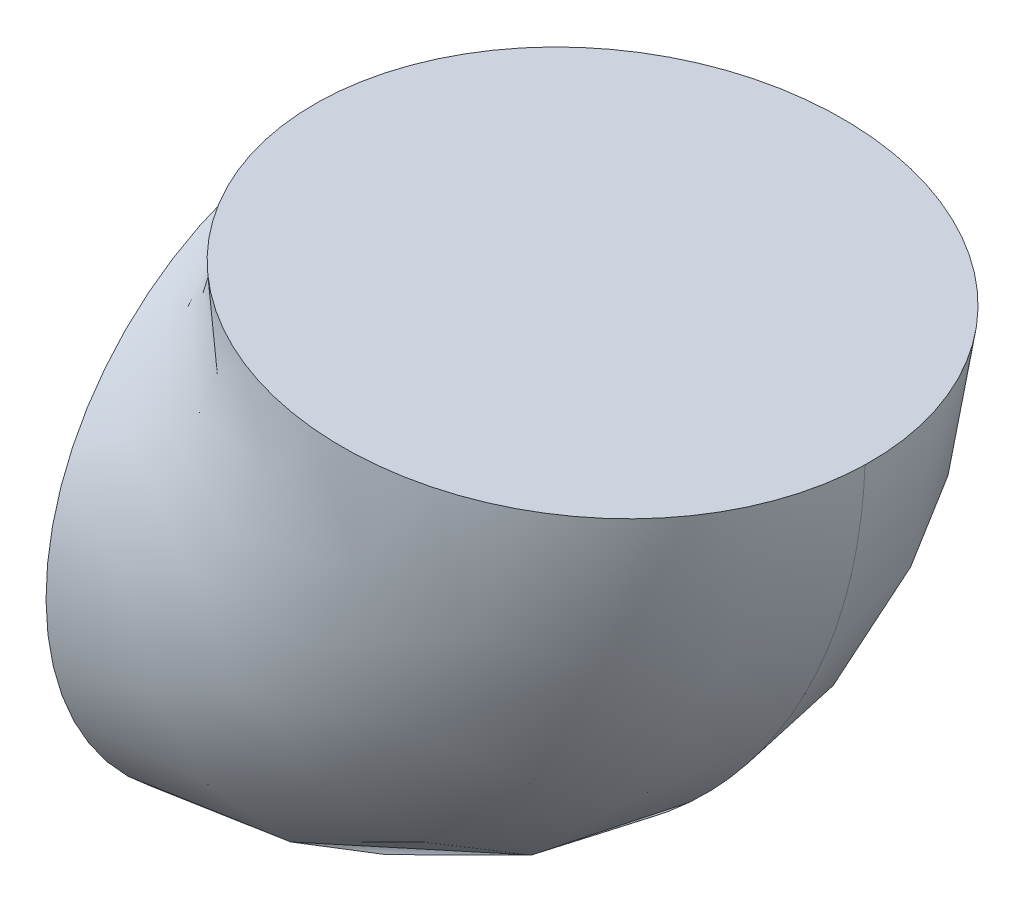
ISO-10303-21;
HEADER;
FILE_DESCRIPTION(('STEP AP214'),'2;1');
FILE_NAME('part.step','',(''),(''),'','','');
FILE_SCHEMA(('AUTOMOTIVE_DESIGN { 1 0 10303 214 1 1 1 1 }'));
ENDSEC;
DATA;
#1=APPLICATION_CONTEXT('core data for automotive mechanical design processes');
#2=APPLICATION_PROTOCOL_DEFINITION('international standard','automotive_design',2000,#1);
#3=PRODUCT_CONTEXT('',#1,'mechanical');
#4=PRODUCT('Part','Part','',(#3));
#5=PRODUCT_RELATED_PRODUCT_CATEGORY('part','',(#4));
#6=PRODUCT_DEFINITION_FORMATION('','',#4);
#7=PRODUCT_DEFINITION_CONTEXT('part definition',#1,'design');
#8=PRODUCT_DEFINITION('design','',#6,#7);
#9=PRODUCT_DEFINITION_SHAPE('','',#8);
#10=(LENGTH_UNIT() NAMED_UNIT(*) SI_UNIT(.MILLI.,.METRE.));
#11=(NAMED_UNIT(*) PLANE_ANGLE_UNIT() SI_UNIT($,.RADIAN.));
#12=(NAMED_UNIT(*) SI_UNIT($,.STERADIAN.) SOLID_ANGLE_UNIT());
#13=UNCERTAINTY_MEASURE_WITH_UNIT(LENGTH_MEASURE(1.E-05),#10,'distance_accuracy_value','');
#14=(GEOMETRIC_REPRESENTATION_CONTEXT(3) GLOBAL_UNCERTAINTY_ASSIGNED_CONTEXT((#13)) GLOBAL_UNIT_ASSIGNED_CONTEXT((#10,
#11,#12)) REPRESENTATION_CONTEXT('',''));
#15=CARTESIAN_POINT('',(0.,0.,0.));
#16=DIRECTION('',(0.,0.,1.));
#17=DIRECTION('',(1.,0.,0.));
#18=AXIS2_PLACEMENT_3D('',#15,#16,#17);
#19=CARTESIAN_POINT('',(-1.719498866658,0.13823021001,2.240651810352));
#20=CARTESIAN_POINT('',(-1.720056991698,0.131102571232,1.953155078414));
#21=CARTESIAN_POINT('',(-1.470219569993,0.118710559588,2.240651810352));
#22=CARTESIAN_POINT('',(-1.470777695032,0.111582920811,1.953155078414));
#23=(BOUNDED_SURFACE() B_SPLINE_SURFACE(1,1,((#19,#20),(#21,#22)),.UNSPECIFIED.,.F.,.F.,
.F.) B_SPLINE_SURFACE_WITH_KNOTS((2,2),(2,2),(-0.125042357102,0.125000008305),(-0.143788452122,
0.143797162284),.UNSPECIFIED.) GEOMETRIC_REPRESENTATION_ITEM() RATIONAL_B_SPLINE_SURFACE(((1.,
1.),(1.,1.))) REPRESENTATION_ITEM('') SURFACE());
#24=CARTESIAN_POINT('',(-1.719735894702,0.134659751833,2.096769251973));
#25=CARTESIAN_POINT('',(-1.719693483359,0.135744821533,2.14040247296));
#26=CARTESIAN_POINT('',(-1.702558082709,0.135491862909,2.184052808033));
#27=CARTESIAN_POINT('',(-1.668336692402,0.133709387518,2.220021575996));
#28=CARTESIAN_POINT('',(-1.621058588677,0.130521273379,2.24062632197));
#29=CARTESIAN_POINT('',(-1.568757000882,0.126426467929,2.240651810352));
#30=CARTESIAN_POINT('',(-1.521538858366,0.122216264726,2.220093115684));
#31=CARTESIAN_POINT('',(-1.4874222082,0.11864840579,2.184157651224));
#32=CARTESIAN_POINT('',(-1.470413950856,0.116228182916,2.140523955542));
#33=CARTESIAN_POINT('',(-1.470498657227,0.115146424586,2.096890713943));
#34=B_SPLINE_CURVE_WITH_KNOTS('',9,(#24,#25,#26,#27,#28,#29,#30,#31,#32,#33),.UNSPECIFIED.,.F.,
.F.,(10,10),(0.,1.),.UNSPECIFIED.);
#35=CARTESIAN_POINT('',(-1.719735894702,0.134659751833,2.096769251973));
#36=VERTEX_POINT('',#35);
#37=CARTESIAN_POINT('',(-1.470498657227,0.115146424586,2.096890713943));
#38=VERTEX_POINT('',#37);
#39=EDGE_CURVE('E61',#36,#38,#34,.T.);
#40=CARTESIAN_POINT('',(-1.470498657227,0.115146424586,2.096890713943));
#41=CARTESIAN_POINT('',(-1.470583311198,0.114065335432,2.053284463897));
#42=CARTESIAN_POINT('',(-1.487739789559,0.114321032936,2.009677762576));
#43=CARTESIAN_POINT('',(-1.521953658335,0.116104066922,1.973755000049));
#44=CARTESIAN_POINT('',(-1.569198169222,0.119290306174,1.953180544944));
#45=CARTESIAN_POINT('',(-1.621454917075,0.123381601007,1.953155078414));
#46=CARTESIAN_POINT('',(-1.668639554953,0.127588425889,1.973683514912));
#47=CARTESIAN_POINT('',(-1.702748817605,0.131154558969,2.009572981202));
#48=CARTESIAN_POINT('',(-1.719778279811,0.133575353357,2.053163022526));
#49=CARTESIAN_POINT('',(-1.719735894702,0.134659751833,2.096769251973));
#50=B_SPLINE_CURVE_WITH_KNOTS('',9,(#40,#41,#42,#43,#44,#45,#46,#47,#48,#49),.UNSPECIFIED.,.F.,
.F.,(10,10),(1.,2.),.UNSPECIFIED.);
#51=EDGE_CURVE('E11',#38,#36,#50,.T.);
#52=ORIENTED_EDGE('',*,*,#39,.T.);
#53=ORIENTED_EDGE('',*,*,#51,.T.);
#54=EDGE_LOOP('',(#52,#53));
#55=FACE_BOUND('',#54,.T.);
#56=ADVANCED_FACE('F17',(#55),#23,.T.);
#57=CARTESIAN_POINT('',(-1.7201171875,-0.125042365407,1.953110641116));
#58=CARTESIAN_POINT('',(-1.7201171875,-0.125042365407,2.240696255522));
#59=CARTESIAN_POINT('',(-1.7201171875,0.125,1.953110641116));
#60=CARTESIAN_POINT('',(-1.7201171875,0.125,2.240696255522));
#61=(BOUNDED_SURFACE() B_SPLINE_SURFACE(1,1,((#57,#58),(#59,#60)),.UNSPECIFIED.,.F.,.F.,
.F.) B_SPLINE_SURFACE_WITH_KNOTS((2,2),(2,2),(-0.125042357102,0.125000008305),(-0.143797162284,
0.143788452122),.UNSPECIFIED.) GEOMETRIC_REPRESENTATION_ITEM() RATIONAL_B_SPLINE_SURFACE(((1.,
1.),(1.,1.))) REPRESENTATION_ITEM('') SURFACE());
#62=CARTESIAN_POINT('',(-1.7201171875,-0.124999940951,2.096769214422));
#63=CARTESIAN_POINT('',(-1.7201171875,-0.124957542739,2.053149503676));
#64=CARTESIAN_POINT('',(-1.7201171875,-0.107791070113,2.009545986059));
#65=CARTESIAN_POINT('',(-1.7201171875,-0.07350750916117,1.973645424184));
#66=CARTESIAN_POINT('',(-1.7201171875,-0.02613846001851,1.953110641116));
#67=CARTESIAN_POINT('',(-1.7201171875,0.0262782013516,1.953136115519));
#68=CARTESIAN_POINT('',(-1.7201171875,0.07362726838711,1.973716931421));
#69=CARTESIAN_POINT('',(-1.7201171875,0.107875917935,2.009650799827));
#70=CARTESIAN_POINT('',(-1.7201171875,0.125,2.053270982592));
#71=CARTESIAN_POINT('',(-1.7201171875,0.125,2.096890713943));
#72=B_SPLINE_CURVE_WITH_KNOTS('',9,(#62,#63,#64,#65,#66,#67,#68,#69,#70,#71),.UNSPECIFIED.,.F.,
.F.,(10,10),(1.,2.),.UNSPECIFIED.);
#73=CARTESIAN_POINT('',(-1.7201171875,-0.124999940951,2.096769214422));
#74=VERTEX_POINT('',#73);
#75=EDGE_CURVE('E32',#74,#36,#72,.T.);
#76=CARTESIAN_POINT('',(-1.7201171875,0.125,2.096890713943));
#77=CARTESIAN_POINT('',(-1.7201171875,0.125,2.140537445192));
#78=CARTESIAN_POINT('',(-1.7201171875,0.107854712138,2.184184630664));
#79=CARTESIAN_POINT('',(-1.7201171875,0.07356365148867,2.220131204929));
#80=CARTESIAN_POINT('',(-1.7201171875,0.02616093622552,2.240696255522));
#81=CARTESIAN_POINT('',(-1.7201171875,-0.02630070230352,2.24067075926));
#82=CARTESIAN_POINT('',(-1.7201171875,-0.0736834060237,2.220059643124));
#83=CARTESIAN_POINT('',(-1.7201171875,-0.107939510541,2.18407975506));
#84=CARTESIAN_POINT('',(-1.7201171875,-0.125042365407,2.140415925052));
#85=CARTESIAN_POINT('',(-1.7201171875,-0.124999940951,2.096769214422));
#86=B_SPLINE_CURVE_WITH_KNOTS('',9,(#76,#77,#78,#79,#80,#81,#82,#83,#84,#85),.UNSPECIFIED.,.F.,
.F.,(10,10),(0.,1.),.UNSPECIFIED.);
#87=EDGE_CURVE('E53',#36,#74,#86,.T.);
#88=ORIENTED_EDGE('',*,*,#75,.F.);
#89=ORIENTED_EDGE('',*,*,#87,.F.);
#90=EDGE_LOOP('',(#88,#89));
#91=FACE_BOUND('',#90,.T.);
#92=ADVANCED_FACE('F54',(#91),#61,.F.);
#93=CARTESIAN_POINT('',(-1.7201171875,-0.124999940951,2.096769214422));
#94=CARTESIAN_POINT('',(-1.643558996026,-0.124942739584,2.096793514326));
#95=CARTESIAN_POINT('',(-1.567045730401,-0.09558761173087,2.09681781423));
#96=CARTESIAN_POINT('',(-1.505778136323,-0.03663131465077,2.096842114135));
#97=CARTESIAN_POINT('',(-1.473507075872,0.03867808481005,2.096866414039));
#98=CARTESIAN_POINT('',(-1.470498657227,0.115146424586,2.096890713943));
#99=CARTESIAN_POINT('',(-1.7201171875,-0.124957542739,2.053149503676));
#100=CARTESIAN_POINT('',(-1.643788533648,-0.12489189022,2.05317649572));
#101=CARTESIAN_POINT('',(-1.567511443164,-0.09570335897225,2.053203487765));
#102=CARTESIAN_POINT('',(-1.506344895487,-0.03710004197526,2.053230479809));
#103=CARTESIAN_POINT('',(-1.473922912866,0.03783980831606,2.053257471853));
#104=CARTESIAN_POINT('',(-1.470583311198,0.114065335432,2.053284463897));
#105=CARTESIAN_POINT('',(-1.7201171875,-0.107791070113,2.009545986059));
#106=CARTESIAN_POINT('',(-1.649130400576,-0.107727416446,2.009572341362));
#107=CARTESIAN_POINT('',(-1.578193607125,-0.080618547854,2.009598696666));
#108=CARTESIAN_POINT('',(-1.521268281265,-0.02619686571596,2.009625051969));
#109=CARTESIAN_POINT('',(-1.49100106034,0.04343423295784,2.009651407273));
#110=CARTESIAN_POINT('',(-1.487739789559,0.114321032936,2.009677762576));
#111=CARTESIAN_POINT('',(-1.7201171875,-0.07350750916117,1.973645424184));
#112=CARTESIAN_POINT('',(-1.659544292102,-0.07345779392972,1.973667339357));
#113=CARTESIAN_POINT('',(-1.599010442955,-0.05031235024959,1.97368925453));
#114=CARTESIAN_POINT('',(-1.550448825068,-0.003838863344414,1.973711169703));
#115=CARTESIAN_POINT('',(-1.524668710904,0.05560926402619,1.973733084876));
#116=CARTESIAN_POINT('',(-1.521953658335,0.116104066922,1.973755000049));
#117=CARTESIAN_POINT('',(-1.7201171875,-0.02613846001851,1.953110641116));
#118=CARTESIAN_POINT('',(-1.67378846993,-0.02611365243833,1.953124621882));
#119=CARTESIAN_POINT('',(-1.627479236189,-0.008336545316741,1.953138602647));
#120=CARTESIAN_POINT('',(-1.590413113475,0.02738395778335,1.953152583413));
#121=CARTESIAN_POINT('',(-1.570937142859,0.0730005562605,1.953166564179));
#122=CARTESIAN_POINT('',(-1.569198169222,0.119290306174,1.953180544944));
#123=CARTESIAN_POINT('',(-1.7201171875,0.0262782013516,1.953136115519));
#124=CARTESIAN_POINT('',(-1.689437390793,0.02627102622837,1.953139908098));
#125=CARTESIAN_POINT('',(-1.658751958757,0.03819216333916,1.953143700677));
#126=CARTESIAN_POINT('',(-1.634358931609,0.06219299360191,1.953147493256));
#127=CARTESIAN_POINT('',(-1.621940555237,0.09269053364198,1.953151285835));
#128=CARTESIAN_POINT('',(-1.621454917075,0.123381601007,1.953155078414));
#129=CARTESIAN_POINT('',(-1.7201171875,0.07362726838711,1.973716931421));
#130=CARTESIAN_POINT('',(-1.703471173931,0.07358720743238,1.973710248119));
#131=CARTESIAN_POINT('',(-1.686793696563,0.08029480821394,1.973703564817));
#132=CARTESIAN_POINT('',(-1.673805750258,0.09387090312983,1.973696881516));
#133=CARTESIAN_POINT('',(-1.667836465932,0.11087948472,1.973690198214));
#134=CARTESIAN_POINT('',(-1.668639554953,0.127588425889,1.973683514912));
#135=CARTESIAN_POINT('',(-1.7201171875,0.107875917935,2.009650799827));
#136=CARTESIAN_POINT('',(-1.713517477897,0.107807979601,2.009635236102));
#137=CARTESIAN_POINT('',(-1.706864409651,0.110822612099,2.009619672377));
#138=CARTESIAN_POINT('',(-1.702082205436,0.117024005579,2.009604108652));
#139=CARTESIAN_POINT('',(-1.700853272215,0.124448132081,2.009588544927));
#140=CARTESIAN_POINT('',(-1.702748817605,0.131154558969,2.009572981202));
#141=CARTESIAN_POINT('',(-1.7201171875,0.125,2.053270982592));
#142=CARTESIAN_POINT('',(-1.718413008061,0.124913137694,2.053249390579));
#143=CARTESIAN_POINT('',(-1.716640607126,0.126176504767,2.053227798566));
#144=CARTESIAN_POINT('',(-1.715907817416,0.1288926182,2.053206206553));
#145=CARTESIAN_POINT('',(-1.717141143405,0.131734730927,2.053184614539));
#146=CARTESIAN_POINT('',(-1.719778279811,0.133575353357,2.053163022526));
#147=CARTESIAN_POINT('',(-1.7201171875,0.125,2.096890713943));
#148=CARTESIAN_POINT('',(-1.718196128366,0.124904660673,2.096866421549));
#149=CARTESIAN_POINT('',(-1.716200189899,0.126329887638,2.096842129155));
#150=CARTESIAN_POINT('',(-1.715376604662,0.129389501474,2.096817836761));
#151=CARTESIAN_POINT('',(-1.71676656149,0.132588934033,2.096793544367));
#152=CARTESIAN_POINT('',(-1.719735894702,0.134659751833,2.096769251973));
#153=(BOUNDED_SURFACE() B_SPLINE_SURFACE(9,5,((#93,#94,#95,#96,#97,#98),(#99,#100,#101,#102,
#103,#104),(#105,#106,#107,#108,#109,#110),(#111,#112,#113,#114,#115,#116),(#117,#118,#119,#120,
#121,#122),(#123,#124,#125,#126,#127,#128),(#129,#130,#131,#132,#133,#134),(#135,#136,#137,#138,
#139,#140),(#141,#142,#143,#144,#145,#146),(#147,#148,#149,#150,#151,#152)),.UNSPECIFIED.,.F.,
.F.,.F.) B_SPLINE_SURFACE_WITH_KNOTS((10,10),(6,6),(1.,2.),(4.712388980385,6.28318530718),
.UNSPECIFIED.) GEOMETRIC_REPRESENTATION_ITEM() RATIONAL_B_SPLINE_SURFACE(((1.,1.,1.,1.,1.,1.),
(1.,1.,1.,1.,1.,1.),(1.,1.,1.,1.,1.,1.),(1.,1.,1.,1.,1.,1.),(1.,1.,1.,1.,1.,1.),(1.,1.,1.,1.,1.,
1.),(1.,1.,1.,1.,1.,1.),(1.,1.,1.,1.,1.,1.),(1.,1.,1.,1.,1.,1.),(1.,1.,1.,1.,1.,1.))) REPRESENTATION_ITEM('') SURFACE());
#154=CARTESIAN_POINT('',(-1.7201171875,-0.124999940951,2.096769214422));
#155=CARTESIAN_POINT('',(-1.643558996026,-0.124942739584,2.096793514326));
#156=CARTESIAN_POINT('',(-1.567045730401,-0.09558761173087,2.09681781423));
#157=CARTESIAN_POINT('',(-1.505778136323,-0.03663131465077,2.096842114135));
#158=CARTESIAN_POINT('',(-1.473507075872,0.03867808481005,2.096866414039));
#159=CARTESIAN_POINT('',(-1.470498657227,0.115146424586,2.096890713943));
#160=(BOUNDED_CURVE() B_SPLINE_CURVE(5,(#154,#155,#156,#157,#158,#159),.UNSPECIFIED.,.F.,
.F.) B_SPLINE_CURVE_WITH_KNOTS((6,6),(4.712388980385,6.28318530718),
.UNSPECIFIED.) CURVE() GEOMETRIC_REPRESENTATION_ITEM() RATIONAL_B_SPLINE_CURVE((1.,1.,1.,1.,1.,1.)) REPRESENTATION_ITEM(''));
#161=EDGE_CURVE('E59',#74,#38,#160,.T.);
#162=ORIENTED_EDGE('',*,*,#161,.F.);
#163=ORIENTED_EDGE('',*,*,#75,.T.);
#164=ORIENTED_EDGE('',*,*,#51,.F.);
#165=EDGE_LOOP('',(#162,#163,#164));
#166=FACE_BOUND('',#165,.T.);
#167=ADVANCED_FACE('F19',(#166),#153,.T.);
#168=CARTESIAN_POINT('',(-1.7201171875,0.125,2.096890713943));
#169=CARTESIAN_POINT('',(-1.718196128366,0.124904660673,2.096866421549));
#170=CARTESIAN_POINT('',(-1.716200189899,0.126329887638,2.096842129155));
#171=CARTESIAN_POINT('',(-1.715376604662,0.129389501474,2.096817836761));
#172=CARTESIAN_POINT('',(-1.71676656149,0.132588934033,2.096793544367));
#173=CARTESIAN_POINT('',(-1.719735894702,0.134659751833,2.096769251973));
#174=CARTESIAN_POINT('',(-1.7201171875,0.125,2.140537445192));
#175=CARTESIAN_POINT('',(-1.717979114426,0.124896178404,2.140510450746));
#176=CARTESIAN_POINT('',(-1.71575950006,0.126483365451,2.140483456299));
#177=CARTESIAN_POINT('',(-1.714845063095,0.129886692311,2.140456461853));
#178=CARTESIAN_POINT('',(-1.716391747715,0.133443665877,2.140429467407));
#179=CARTESIAN_POINT('',(-1.719693483359,0.135744821533,2.14040247296));
#180=CARTESIAN_POINT('',(-1.7201171875,0.107854712138,2.184184630664));
#181=CARTESIAN_POINT('',(-1.712643355111,0.107752867984,2.184158266138));
#182=CARTESIAN_POINT('',(-1.705089534511,0.111417512932,2.184131901612));
#183=CARTESIAN_POINT('',(-1.699938906825,0.118998081817,2.184105537085));
#184=CARTESIAN_POINT('',(-1.699333838919,0.127858054098,2.184079172559));
#185=CARTESIAN_POINT('',(-1.702558082709,0.135491862909,2.184052808033));
#186=CARTESIAN_POINT('',(-1.7201171875,0.07356365148867,2.220131204929));
#187=CARTESIAN_POINT('',(-1.702226995767,0.07347574140346,2.220109279142));
#188=CARTESIAN_POINT('',(-1.684267759616,0.08110481987914,2.220087353356));
#189=CARTESIAN_POINT('',(-1.670751514924,0.09663562320063,2.220065427569));
#190=CARTESIAN_POINT('',(-1.665658495703,0.115681106947,2.220043501782));
#191=CARTESIAN_POINT('',(-1.668336692402,0.133709387518,2.220021575996));
#192=CARTESIAN_POINT('',(-1.7201171875,0.02616093622552,2.240696255522));
#193=CARTESIAN_POINT('',(-1.687972616392,0.02609794844806,2.240682268811));
#194=CARTESIAN_POINT('',(-1.6557785748,0.03909923702332,2.240668282101));
#195=CARTESIAN_POINT('',(-1.630758632236,0.06539078993171,2.240654295391));
#196=CARTESIAN_POINT('',(-1.619357045266,0.0982777613015,2.240640308681));
#197=CARTESIAN_POINT('',(-1.621058588677,0.130521273379,2.24062632197));
#198=CARTESIAN_POINT('',(-1.7201171875,-0.02630070230352,2.24067075926));
#199=CARTESIAN_POINT('',(-1.672310267662,-0.02633167993418,2.240666969478));
#200=CARTESIAN_POINT('',(-1.62447901805,-0.007469396516557,2.240663179697));
#201=CARTESIAN_POINT('',(-1.586775105518,0.03055188552758,2.240659389915));
#202=CARTESIAN_POINT('',(-1.568309868396,0.07857088854327,2.240655600134));
#203=CARTESIAN_POINT('',(-1.568757000882,0.126426467929,2.240651810352));
#204=CARTESIAN_POINT('',(-1.7201171875,-0.0736834060237,2.220059643124));
#205=CARTESIAN_POINT('',(-1.658266592912,-0.07368147141367,2.220066337636));
#206=CARTESIAN_POINT('',(-1.596417517762,-0.04960200616338,2.220073032148));
#207=CARTESIAN_POINT('',(-1.547300454878,-0.001148706536329,2.22007972666));
#208=CARTESIAN_POINT('',(-1.522381487984,0.06036870901594,2.220086421172));
#209=CARTESIAN_POINT('',(-1.521538858366,0.122216264726,2.220093115684));
#210=CARTESIAN_POINT('',(-1.7201171875,-0.107939510541,2.18407975506));
#211=CARTESIAN_POINT('',(-1.648218292069,-0.107909685061,2.184095334292));
#212=CARTESIAN_POINT('',(-1.576342821517,-0.0801365894123,2.184110913525));
#213=CARTESIAN_POINT('',(-1.519018309893,-0.02430728388808,2.184126492758));
#214=CARTESIAN_POINT('',(-1.489357822891,0.04679636011462,2.184142071991));
#215=CARTESIAN_POINT('',(-1.4874222082,0.11864840579,2.184157651224));
#216=CARTESIAN_POINT('',(-1.7201171875,-0.125042365407,2.140415925052));
#217=CARTESIAN_POINT('',(-1.643329316324,-0.124993620422,2.14043753115));
#218=CARTESIAN_POINT('',(-1.56657972937,-0.09547179284385,2.140459137248));
#219=CARTESIAN_POINT('',(-1.505211026345,-0.03616229719175,2.140480743346));
#220=CARTESIAN_POINT('',(-1.473090981482,0.03951688018343,2.140502349444));
#221=CARTESIAN_POINT('',(-1.470413950856,0.116228182916,2.140523955542));
#222=CARTESIAN_POINT('',(-1.7201171875,-0.124999940951,2.096769214422));
#223=CARTESIAN_POINT('',(-1.643558996026,-0.124942739584,2.096793514326));
#224=CARTESIAN_POINT('',(-1.567045730401,-0.09558761173087,2.09681781423));
#225=CARTESIAN_POINT('',(-1.505778136323,-0.03663131465077,2.096842114135));
#226=CARTESIAN_POINT('',(-1.473507075872,0.03867808481005,2.096866414039));
#227=CARTESIAN_POINT('',(-1.470498657227,0.115146424586,2.096890713943));
#228=(BOUNDED_SURFACE() B_SPLINE_SURFACE(9,5,((#168,#169,#170,#171,#172,#173),(#174,#175,#176,
#177,#178,#179),(#180,#181,#182,#183,#184,#185),(#186,#187,#188,#189,#190,#191),(#192,#193,#194,
#195,#196,#197),(#198,#199,#200,#201,#202,#203),(#204,#205,#206,#207,#208,#209),(#210,#211,#212,
#213,#214,#215),(#216,#217,#218,#219,#220,#221),(#222,#223,#224,#225,#226,#227)),.UNSPECIFIED.,
.F.,.F.,.F.) B_SPLINE_SURFACE_WITH_KNOTS((10,10),(6,6),(0.,1.),(4.712388980385,6.28318530718),
.UNSPECIFIED.) GEOMETRIC_REPRESENTATION_ITEM() RATIONAL_B_SPLINE_SURFACE(((1.,1.,1.,1.,1.,1.),
(1.,1.,1.,1.,1.,1.),(1.,1.,1.,1.,1.,1.),(1.,1.,1.,1.,1.,1.),(1.,1.,1.,1.,1.,1.),(1.,1.,1.,1.,1.,
1.),(1.,1.,1.,1.,1.,1.),(1.,1.,1.,1.,1.,1.),(1.,1.,1.,1.,1.,1.),(1.,1.,1.,1.,1.,1.))) REPRESENTATION_ITEM('') SURFACE());
#229=ORIENTED_EDGE('',*,*,#39,.F.);
#230=ORIENTED_EDGE('',*,*,#87,.T.);
#231=ORIENTED_EDGE('',*,*,#161,.T.);
#232=EDGE_LOOP('',(#229,#230,#231));
#233=FACE_BOUND('',#232,.T.);
#234=ADVANCED_FACE('F64',(#233),#228,.T.);
#235=CLOSED_SHELL('',(#56,#92,#167,#234));
#236=MANIFOLD_SOLID_BREP('B1',#235);
#237=ADVANCED_BREP_SHAPE_REPRESENTATION('',(#18,#236),#14);
#238=SHAPE_DEFINITION_REPRESENTATION(#9,#237);
ENDSEC;
END-ISO-10303-21;
